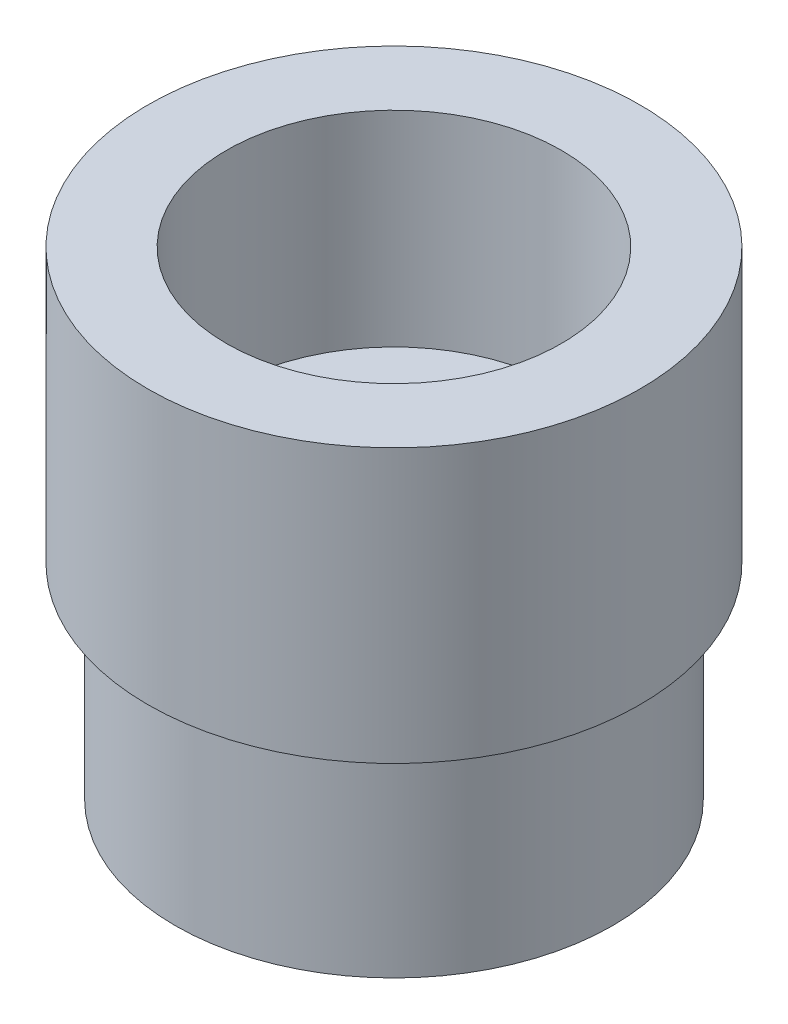
ISO-10303-21;
HEADER;
FILE_DESCRIPTION(('STEP AP214'),'2;1');
FILE_NAME('part.step','',(''),(''),'','','');
FILE_SCHEMA(('AUTOMOTIVE_DESIGN { 1 0 10303 214 1 1 1 1 }'));
ENDSEC;
DATA;
#1=APPLICATION_CONTEXT('core data for automotive mechanical design processes');
#2=APPLICATION_PROTOCOL_DEFINITION('international standard','automotive_design',2000,#1);
#3=PRODUCT_CONTEXT('',#1,'mechanical');
#4=PRODUCT('Part','Part','',(#3));
#5=PRODUCT_RELATED_PRODUCT_CATEGORY('part','',(#4));
#6=PRODUCT_DEFINITION_FORMATION('','',#4);
#7=PRODUCT_DEFINITION_CONTEXT('part definition',#1,'design');
#8=PRODUCT_DEFINITION('design','',#6,#7);
#9=PRODUCT_DEFINITION_SHAPE('','',#8);
#10=(LENGTH_UNIT() NAMED_UNIT(*) SI_UNIT(.MILLI.,.METRE.));
#11=(NAMED_UNIT(*) PLANE_ANGLE_UNIT() SI_UNIT($,.RADIAN.));
#12=(NAMED_UNIT(*) SI_UNIT($,.STERADIAN.) SOLID_ANGLE_UNIT());
#13=UNCERTAINTY_MEASURE_WITH_UNIT(LENGTH_MEASURE(1.E-05),#10,'distance_accuracy_value','');
#14=(GEOMETRIC_REPRESENTATION_CONTEXT(3) GLOBAL_UNCERTAINTY_ASSIGNED_CONTEXT((#13)) GLOBAL_UNIT_ASSIGNED_CONTEXT((#10,
#11,#12)) REPRESENTATION_CONTEXT('',''));
#15=CARTESIAN_POINT('',(0.,0.,0.));
#16=DIRECTION('',(0.,0.,1.));
#17=DIRECTION('',(1.,0.,0.));
#18=AXIS2_PLACEMENT_3D('',#15,#16,#17);
#19=CARTESIAN_POINT('',(0.,5.08,0.));
#20=DIRECTION('',(0.,-1.,0.));
#21=DIRECTION('',(0.,0.,-1.));
#22=AXIS2_PLACEMENT_3D('',#19,#20,#21);
#23=CYLINDRICAL_SURFACE('',#22,4.572);
#24=CARTESIAN_POINT('',(0.,5.08,0.));
#25=DIRECTION('',(0.,1.,0.));
#26=DIRECTION('',(0.,0.,1.));
#27=AXIS2_PLACEMENT_3D('',#24,#25,#26);
#28=CIRCLE('',#27,4.572);
#29=CARTESIAN_POINT('',(0.,5.08,4.572));
#30=VERTEX_POINT('',#29);
#31=EDGE_CURVE('E50',#30,#30,#28,.T.);
#32=ORIENTED_EDGE('',*,*,#31,.F.);
#33=EDGE_LOOP('',(#32));
#34=FACE_BOUND('',#33,.T.);
#35=CARTESIAN_POINT('',(0.,0.,0.));
#36=DIRECTION('',(0.,1.,0.));
#37=DIRECTION('',(0.,0.,1.));
#38=AXIS2_PLACEMENT_3D('',#35,#36,#37);
#39=CIRCLE('',#38,4.572);
#40=CARTESIAN_POINT('',(0.,0.,4.572));
#41=VERTEX_POINT('',#40);
#42=EDGE_CURVE('E55',#41,#41,#39,.T.);
#43=ORIENTED_EDGE('',*,*,#42,.T.);
#44=EDGE_LOOP('',(#43));
#45=FACE_BOUND('',#44,.T.);
#46=ADVANCED_FACE('F43',(#34,#45),#23,.T.);
#47=CARTESIAN_POINT('',(0.,5.08,0.));
#48=DIRECTION('',(0.,1.,0.));
#49=DIRECTION('',(0.,0.,1.));
#50=AXIS2_PLACEMENT_3D('',#47,#48,#49);
#51=PLANE('',#50);
#52=CARTESIAN_POINT('',(0.,5.08,0.));
#53=DIRECTION('',(0.,1.,0.));
#54=DIRECTION('',(0.,0.,1.));
#55=AXIS2_PLACEMENT_3D('',#52,#53,#54);
#56=CIRCLE('',#55,3.1115);
#57=CARTESIAN_POINT('',(0.,5.08,3.1115));
#58=VERTEX_POINT('',#57);
#59=EDGE_CURVE('E63',#58,#58,#56,.T.);
#60=ORIENTED_EDGE('',*,*,#59,.F.);
#61=EDGE_LOOP('',(#60));
#62=FACE_BOUND('',#61,.T.);
#63=ORIENTED_EDGE('',*,*,#31,.T.);
#64=EDGE_LOOP('',(#63));
#65=FACE_BOUND('',#64,.T.);
#66=ADVANCED_FACE('F103',(#62,#65),#51,.T.);
#67=CARTESIAN_POINT('',(0.,0.,0.));
#68=DIRECTION('',(0.,1.,0.));
#69=DIRECTION('',(0.,0.,1.));
#70=AXIS2_PLACEMENT_3D('',#67,#68,#69);
#71=PLANE('',#70);
#72=CARTESIAN_POINT('',(0.,0.,0.));
#73=DIRECTION('',(0.,1.,0.));
#74=DIRECTION('',(0.,0.,1.));
#75=AXIS2_PLACEMENT_3D('',#72,#73,#74);
#76=CIRCLE('',#75,4.064);
#77=CARTESIAN_POINT('',(0.,0.,4.064));
#78=VERTEX_POINT('',#77);
#79=EDGE_CURVE('E11',#78,#78,#76,.F.);
#80=ORIENTED_EDGE('',*,*,#79,.F.);
#81=EDGE_LOOP('',(#80));
#82=FACE_BOUND('',#81,.T.);
#83=ORIENTED_EDGE('',*,*,#42,.F.);
#84=EDGE_LOOP('',(#83));
#85=FACE_BOUND('',#84,.T.);
#86=ADVANCED_FACE('F108',(#82,#85),#71,.F.);
#87=CARTESIAN_POINT('',(0.,1.27,0.));
#88=DIRECTION('',(0.,1.,0.));
#89=DIRECTION('',(0.,0.,1.));
#90=AXIS2_PLACEMENT_3D('',#87,#88,#89);
#91=CYLINDRICAL_SURFACE('',#90,3.1115);
#92=CARTESIAN_POINT('',(0.,1.27,0.));
#93=DIRECTION('',(0.,1.,0.));
#94=DIRECTION('',(0.,0.,1.));
#95=AXIS2_PLACEMENT_3D('',#92,#93,#94);
#96=CIRCLE('',#95,3.1115);
#97=CARTESIAN_POINT('',(0.,1.27,3.1115));
#98=VERTEX_POINT('',#97);
#99=EDGE_CURVE('E61',#98,#98,#96,.T.);
#100=CARTESIAN_POINT('',(0.,1.27,3.1115));
#101=CARTESIAN_POINT('',(0.,1.3096875,3.1115));
#102=CARTESIAN_POINT('',(0.,1.349375,3.1115));
#103=CARTESIAN_POINT('',(0.,1.42875,3.1115));
#104=CARTESIAN_POINT('',(0.,1.4684375,3.1115));
#105=CARTESIAN_POINT('',(0.,1.5478125,3.1115));
#106=CARTESIAN_POINT('',(0.,1.5875,3.1115));
#107=CARTESIAN_POINT('',(0.,1.666875,3.1115));
#108=CARTESIAN_POINT('',(0.,1.7065625,3.1115));
#109=CARTESIAN_POINT('',(0.,1.7859375,3.1115));
#110=CARTESIAN_POINT('',(0.,1.825625,3.1115));
#111=CARTESIAN_POINT('',(0.,1.905,3.1115));
#112=CARTESIAN_POINT('',(0.,1.9446875,3.1115));
#113=CARTESIAN_POINT('',(0.,2.0240625,3.1115));
#114=CARTESIAN_POINT('',(0.,2.06375,3.1115));
#115=CARTESIAN_POINT('',(0.,2.143125,3.1115));
#116=CARTESIAN_POINT('',(0.,2.1828125,3.1115));
#117=CARTESIAN_POINT('',(0.,2.2621875,3.1115));
#118=CARTESIAN_POINT('',(0.,2.301875,3.1115));
#119=CARTESIAN_POINT('',(0.,2.38125,3.1115));
#120=CARTESIAN_POINT('',(0.,2.4209375,3.1115));
#121=CARTESIAN_POINT('',(0.,2.5003125,3.1115));
#122=CARTESIAN_POINT('',(0.,2.54,3.1115));
#123=CARTESIAN_POINT('',(0.,2.619375,3.1115));
#124=CARTESIAN_POINT('',(0.,2.6590625,3.1115));
#125=CARTESIAN_POINT('',(0.,2.7384375,3.1115));
#126=CARTESIAN_POINT('',(0.,2.778125,3.1115));
#127=CARTESIAN_POINT('',(0.,2.8575,3.1115));
#128=CARTESIAN_POINT('',(0.,2.8971875,3.1115));
#129=CARTESIAN_POINT('',(0.,2.9765625,3.1115));
#130=CARTESIAN_POINT('',(0.,3.01625,3.1115));
#131=CARTESIAN_POINT('',(0.,3.095625,3.1115));
#132=CARTESIAN_POINT('',(0.,3.1353125,3.1115));
#133=CARTESIAN_POINT('',(0.,3.2146875,3.1115));
#134=CARTESIAN_POINT('',(0.,3.254375,3.1115));
#135=CARTESIAN_POINT('',(0.,3.33375,3.1115));
#136=CARTESIAN_POINT('',(0.,3.3734375,3.1115));
#137=CARTESIAN_POINT('',(0.,3.4528125,3.1115));
#138=CARTESIAN_POINT('',(0.,3.4925,3.1115));
#139=CARTESIAN_POINT('',(0.,3.571875,3.1115));
#140=CARTESIAN_POINT('',(0.,3.6115625,3.1115));
#141=CARTESIAN_POINT('',(0.,3.6909375,3.1115));
#142=CARTESIAN_POINT('',(0.,3.730625,3.1115));
#143=CARTESIAN_POINT('',(0.,3.81,3.1115));
#144=CARTESIAN_POINT('',(0.,3.8496875,3.1115));
#145=CARTESIAN_POINT('',(0.,3.9290625,3.1115));
#146=CARTESIAN_POINT('',(0.,3.96875,3.1115));
#147=CARTESIAN_POINT('',(0.,4.048125,3.1115));
#148=CARTESIAN_POINT('',(0.,4.0878125,3.1115));
#149=CARTESIAN_POINT('',(0.,4.1671875,3.1115));
#150=CARTESIAN_POINT('',(0.,4.206875,3.1115));
#151=CARTESIAN_POINT('',(0.,4.28625,3.1115));
#152=CARTESIAN_POINT('',(0.,4.3259375,3.1115));
#153=CARTESIAN_POINT('',(0.,4.4053125,3.1115));
#154=CARTESIAN_POINT('',(0.,4.445,3.1115));
#155=CARTESIAN_POINT('',(0.,4.524375,3.1115));
#156=CARTESIAN_POINT('',(0.,4.5640625,3.1115));
#157=CARTESIAN_POINT('',(0.,4.6434375,3.1115));
#158=CARTESIAN_POINT('',(0.,4.683125,3.1115));
#159=CARTESIAN_POINT('',(0.,4.7625,3.1115));
#160=CARTESIAN_POINT('',(0.,4.8021875,3.1115));
#161=CARTESIAN_POINT('',(0.,4.8815625,3.1115));
#162=CARTESIAN_POINT('',(0.,4.92125,3.1115));
#163=CARTESIAN_POINT('',(0.,5.000625,3.1115));
#164=CARTESIAN_POINT('',(0.,5.0403125,3.1115));
#165=CARTESIAN_POINT('',(0.,5.08,3.1115));
#166=B_SPLINE_CURVE_WITH_KNOTS('',3,(#100,#101,#102,#103,#104,#105,#106,#107,#108,#109,#110,
#111,#112,#113,#114,#115,#116,#117,#118,#119,#120,#121,#122,#123,#124,#125,#126,#127,#128,#129,
#130,#131,#132,#133,#134,#135,#136,#137,#138,#139,#140,#141,#142,#143,#144,#145,#146,#147,#148,
#149,#150,#151,#152,#153,#154,#155,#156,#157,#158,#159,#160,#161,#162,#163,#164,#165),
.UNSPECIFIED.,.F.,.F.,(4,2,2,2,2,2,2,2,2,2,2,2,2,2,2,2,2,2,2,2,2,2,2,2,2,2,2,2,2,2,2,2,4),(0.,
0.1190625,0.238125,0.3571875,0.47625,0.5953125,0.714375,0.8334375,0.9525,1.0715625,1.190625,
1.3096875,1.42875,1.5478125,1.666875,1.7859375,1.905,2.0240625,2.143125,2.2621875,2.38125,
2.5003125,2.619375,2.7384375,2.8575,2.9765625,3.095625,3.2146875,3.33375,3.4528125,3.571875,
3.6909375,3.81),.UNSPECIFIED.);
#167=EDGE_CURVE('BSEAM98',#98,#58,#166,.T.);
#168=ORIENTED_EDGE('',*,*,#99,.F.);
#169=ORIENTED_EDGE('',*,*,#59,.T.);
#170=ORIENTED_EDGE('',*,*,#167,.T.);
#171=ORIENTED_EDGE('',*,*,#167,.F.);
#172=EDGE_LOOP('',(#168,#170,#169,#171));
#173=FACE_BOUND('',#172,.T.);
#174=ADVANCED_FACE('F98',(#173),#91,.F.);
#175=CARTESIAN_POINT('',(0.,1.27,0.));
#176=DIRECTION('',(0.,1.,0.));
#177=DIRECTION('',(0.,0.,1.));
#178=AXIS2_PLACEMENT_3D('',#175,#176,#177);
#179=PLANE('',#178);
#180=ORIENTED_EDGE('',*,*,#99,.T.);
#181=EDGE_LOOP('',(#180));
#182=FACE_BOUND('',#181,.T.);
#183=ADVANCED_FACE('F89',(#182),#179,.T.);
#184=CARTESIAN_POINT('',(0.,-3.81,0.));
#185=DIRECTION('',(0.,-1.,0.));
#186=DIRECTION('',(0.,0.,-1.));
#187=AXIS2_PLACEMENT_3D('',#184,#185,#186);
#188=PLANE('',#187);
#189=CARTESIAN_POINT('',(0.,-3.81,0.));
#190=DIRECTION('',(0.,-1.,0.));
#191=DIRECTION('',(-1.,0.,0.));
#192=AXIS2_PLACEMENT_3D('',#189,#190,#191);
#193=CIRCLE('',#192,4.064);
#194=CARTESIAN_POINT('',(0.,-3.81,4.064));
#195=VERTEX_POINT('',#194);
#196=EDGE_CURVE('E67',#195,#195,#193,.T.);
#197=ORIENTED_EDGE('',*,*,#196,.T.);
#198=EDGE_LOOP('',(#197));
#199=FACE_BOUND('',#198,.T.);
#200=CARTESIAN_POINT('',(0.,-3.81,0.));
#201=DIRECTION('',(0.,-1.,0.));
#202=DIRECTION('',(0.,0.,-1.));
#203=AXIS2_PLACEMENT_3D('',#200,#201,#202);
#204=CIRCLE('',#203,2.794);
#205=CARTESIAN_POINT('',(0.,-3.81,2.794));
#206=VERTEX_POINT('',#205);
#207=EDGE_CURVE('E74',#206,#206,#204,.T.);
#208=ORIENTED_EDGE('',*,*,#207,.F.);
#209=EDGE_LOOP('',(#208));
#210=FACE_BOUND('',#209,.T.);
#211=ADVANCED_FACE('F86',(#199,#210),#188,.T.);
#212=CARTESIAN_POINT('',(0.,-3.81,0.));
#213=DIRECTION('',(0.,1.,0.));
#214=DIRECTION('',(0.,0.,1.));
#215=AXIS2_PLACEMENT_3D('',#212,#213,#214);
#216=CYLINDRICAL_SURFACE('',#215,4.064);
#217=CARTESIAN_POINT('',(0.,-3.81,4.064));
#218=CARTESIAN_POINT('',(0.,-3.7703125,4.064));
#219=CARTESIAN_POINT('',(0.,-3.730625,4.064));
#220=CARTESIAN_POINT('',(0.,-3.65125,4.064));
#221=CARTESIAN_POINT('',(0.,-3.6115625,4.064));
#222=CARTESIAN_POINT('',(0.,-3.5321875,4.064));
#223=CARTESIAN_POINT('',(0.,-3.4925,4.064));
#224=CARTESIAN_POINT('',(0.,-3.413125,4.064));
#225=CARTESIAN_POINT('',(0.,-3.3734375,4.064));
#226=CARTESIAN_POINT('',(0.,-3.2940625,4.064));
#227=CARTESIAN_POINT('',(0.,-3.254375,4.064));
#228=CARTESIAN_POINT('',(0.,-3.175,4.064));
#229=CARTESIAN_POINT('',(0.,-3.1353125,4.064));
#230=CARTESIAN_POINT('',(0.,-3.0559375,4.064));
#231=CARTESIAN_POINT('',(0.,-3.01625,4.064));
#232=CARTESIAN_POINT('',(0.,-2.936875,4.064));
#233=CARTESIAN_POINT('',(0.,-2.8971875,4.064));
#234=CARTESIAN_POINT('',(0.,-2.8178125,4.064));
#235=CARTESIAN_POINT('',(0.,-2.778125,4.064));
#236=CARTESIAN_POINT('',(0.,-2.69875,4.064));
#237=CARTESIAN_POINT('',(0.,-2.6590625,4.064));
#238=CARTESIAN_POINT('',(0.,-2.5796875,4.064));
#239=CARTESIAN_POINT('',(0.,-2.54,4.064));
#240=CARTESIAN_POINT('',(0.,-2.460625,4.064));
#241=CARTESIAN_POINT('',(0.,-2.4209375,4.064));
#242=CARTESIAN_POINT('',(0.,-2.3415625,4.064));
#243=CARTESIAN_POINT('',(0.,-2.301875,4.064));
#244=CARTESIAN_POINT('',(0.,-2.2225,4.064));
#245=CARTESIAN_POINT('',(0.,-2.1828125,4.064));
#246=CARTESIAN_POINT('',(0.,-2.1034375,4.064));
#247=CARTESIAN_POINT('',(0.,-2.06375,4.064));
#248=CARTESIAN_POINT('',(0.,-1.984375,4.064));
#249=CARTESIAN_POINT('',(0.,-1.9446875,4.064));
#250=CARTESIAN_POINT('',(0.,-1.8653125,4.064));
#251=CARTESIAN_POINT('',(0.,-1.825625,4.064));
#252=CARTESIAN_POINT('',(0.,-1.74625,4.064));
#253=CARTESIAN_POINT('',(0.,-1.7065625,4.064));
#254=CARTESIAN_POINT('',(0.,-1.6271875,4.064));
#255=CARTESIAN_POINT('',(0.,-1.5875,4.064));
#256=CARTESIAN_POINT('',(0.,-1.508125,4.064));
#257=CARTESIAN_POINT('',(0.,-1.4684375,4.064));
#258=CARTESIAN_POINT('',(0.,-1.3890625,4.064));
#259=CARTESIAN_POINT('',(0.,-1.349375,4.064));
#260=CARTESIAN_POINT('',(0.,-1.27,4.064));
#261=CARTESIAN_POINT('',(0.,-1.2303125,4.064));
#262=CARTESIAN_POINT('',(0.,-1.1509375,4.064));
#263=CARTESIAN_POINT('',(0.,-1.11125,4.064));
#264=CARTESIAN_POINT('',(0.,-1.031875,4.064));
#265=CARTESIAN_POINT('',(0.,-0.9921875,4.064));
#266=CARTESIAN_POINT('',(0.,-0.9128125,4.064));
#267=CARTESIAN_POINT('',(0.,-0.873125,4.064));
#268=CARTESIAN_POINT('',(0.,-0.79375,4.064));
#269=CARTESIAN_POINT('',(0.,-0.7540625,4.064));
#270=CARTESIAN_POINT('',(0.,-0.6746875,4.064));
#271=CARTESIAN_POINT('',(0.,-0.635,4.064));
#272=CARTESIAN_POINT('',(0.,-0.555625,4.064));
#273=CARTESIAN_POINT('',(0.,-0.5159375,4.064));
#274=CARTESIAN_POINT('',(0.,-0.4365625,4.064));
#275=CARTESIAN_POINT('',(0.,-0.396875,4.064));
#276=CARTESIAN_POINT('',(0.,-0.3175,4.064));
#277=CARTESIAN_POINT('',(0.,-0.2778125,4.064));
#278=CARTESIAN_POINT('',(0.,-0.1984375,4.064));
#279=CARTESIAN_POINT('',(0.,-0.15875,4.064));
#280=CARTESIAN_POINT('',(0.,-0.0793749999999999,4.064));
#281=CARTESIAN_POINT('',(0.,-0.0396874999999999,4.064));
#282=CARTESIAN_POINT('',(0.,0.,4.064));
#283=B_SPLINE_CURVE_WITH_KNOTS('',3,(#217,#218,#219,#220,#221,#222,#223,#224,#225,#226,#227,
#228,#229,#230,#231,#232,#233,#234,#235,#236,#237,#238,#239,#240,#241,#242,#243,#244,#245,#246,
#247,#248,#249,#250,#251,#252,#253,#254,#255,#256,#257,#258,#259,#260,#261,#262,#263,#264,#265,
#266,#267,#268,#269,#270,#271,#272,#273,#274,#275,#276,#277,#278,#279,#280,#281,#282),
.UNSPECIFIED.,.F.,.F.,(4,2,2,2,2,2,2,2,2,2,2,2,2,2,2,2,2,2,2,2,2,2,2,2,2,2,2,2,2,2,2,2,4),(0.,
0.1190625,0.238125,0.3571875,0.47625,0.5953125,0.714375,0.8334375,0.9525,1.0715625,1.190625,
1.3096875,1.42875,1.5478125,1.666875,1.7859375,1.905,2.0240625,2.143125,2.2621875,2.38125,
2.5003125,2.619375,2.7384375,2.8575,2.9765625,3.095625,3.2146875,3.33375,3.4528125,3.571875,
3.6909375,3.81),.UNSPECIFIED.);
#284=EDGE_CURVE('BSEAM88',#195,#78,#283,.T.);
#285=ORIENTED_EDGE('',*,*,#196,.F.);
#286=ORIENTED_EDGE('',*,*,#79,.T.);
#287=ORIENTED_EDGE('',*,*,#284,.T.);
#288=ORIENTED_EDGE('',*,*,#284,.F.);
#289=EDGE_LOOP('',(#285,#287,#286,#288));
#290=FACE_BOUND('',#289,.T.);
#291=ADVANCED_FACE('F88',(#290),#216,.T.);
#292=CARTESIAN_POINT('',(0.,-3.81,0.));
#293=DIRECTION('',(0.,1.,0.));
#294=DIRECTION('',(0.,0.,1.));
#295=AXIS2_PLACEMENT_3D('',#292,#293,#294);
#296=CYLINDRICAL_SURFACE('',#295,2.794);
#297=CARTESIAN_POINT('',(0.,0.,0.));
#298=DIRECTION('',(0.,-1.,0.));
#299=DIRECTION('',(0.,0.,-1.));
#300=AXIS2_PLACEMENT_3D('',#297,#298,#299);
#301=CIRCLE('',#300,2.794);
#302=CARTESIAN_POINT('',(0.,0.,2.794));
#303=VERTEX_POINT('',#302);
#304=EDGE_CURVE('E75',#303,#303,#301,.T.);
#305=CARTESIAN_POINT('',(0.,-3.81,2.794));
#306=CARTESIAN_POINT('',(0.,-3.7703125,2.794));
#307=CARTESIAN_POINT('',(0.,-3.730625,2.794));
#308=CARTESIAN_POINT('',(0.,-3.65125,2.794));
#309=CARTESIAN_POINT('',(0.,-3.6115625,2.794));
#310=CARTESIAN_POINT('',(0.,-3.5321875,2.794));
#311=CARTESIAN_POINT('',(0.,-3.4925,2.794));
#312=CARTESIAN_POINT('',(0.,-3.413125,2.794));
#313=CARTESIAN_POINT('',(0.,-3.3734375,2.794));
#314=CARTESIAN_POINT('',(0.,-3.2940625,2.794));
#315=CARTESIAN_POINT('',(0.,-3.254375,2.794));
#316=CARTESIAN_POINT('',(0.,-3.175,2.794));
#317=CARTESIAN_POINT('',(0.,-3.1353125,2.794));
#318=CARTESIAN_POINT('',(0.,-3.0559375,2.794));
#319=CARTESIAN_POINT('',(0.,-3.01625,2.794));
#320=CARTESIAN_POINT('',(0.,-2.936875,2.794));
#321=CARTESIAN_POINT('',(0.,-2.8971875,2.794));
#322=CARTESIAN_POINT('',(0.,-2.8178125,2.794));
#323=CARTESIAN_POINT('',(0.,-2.778125,2.794));
#324=CARTESIAN_POINT('',(0.,-2.69875,2.794));
#325=CARTESIAN_POINT('',(0.,-2.6590625,2.794));
#326=CARTESIAN_POINT('',(0.,-2.5796875,2.794));
#327=CARTESIAN_POINT('',(0.,-2.54,2.794));
#328=CARTESIAN_POINT('',(0.,-2.460625,2.794));
#329=CARTESIAN_POINT('',(0.,-2.4209375,2.794));
#330=CARTESIAN_POINT('',(0.,-2.3415625,2.794));
#331=CARTESIAN_POINT('',(0.,-2.301875,2.794));
#332=CARTESIAN_POINT('',(0.,-2.2225,2.794));
#333=CARTESIAN_POINT('',(0.,-2.1828125,2.794));
#334=CARTESIAN_POINT('',(0.,-2.1034375,2.794));
#335=CARTESIAN_POINT('',(0.,-2.06375,2.794));
#336=CARTESIAN_POINT('',(0.,-1.984375,2.794));
#337=CARTESIAN_POINT('',(0.,-1.9446875,2.794));
#338=CARTESIAN_POINT('',(0.,-1.8653125,2.794));
#339=CARTESIAN_POINT('',(0.,-1.825625,2.794));
#340=CARTESIAN_POINT('',(0.,-1.74625,2.794));
#341=CARTESIAN_POINT('',(0.,-1.7065625,2.794));
#342=CARTESIAN_POINT('',(0.,-1.6271875,2.794));
#343=CARTESIAN_POINT('',(0.,-1.5875,2.794));
#344=CARTESIAN_POINT('',(0.,-1.508125,2.794));
#345=CARTESIAN_POINT('',(0.,-1.4684375,2.794));
#346=CARTESIAN_POINT('',(0.,-1.3890625,2.794));
#347=CARTESIAN_POINT('',(0.,-1.349375,2.794));
#348=CARTESIAN_POINT('',(0.,-1.27,2.794));
#349=CARTESIAN_POINT('',(0.,-1.2303125,2.794));
#350=CARTESIAN_POINT('',(0.,-1.1509375,2.794));
#351=CARTESIAN_POINT('',(0.,-1.11125,2.794));
#352=CARTESIAN_POINT('',(0.,-1.031875,2.794));
#353=CARTESIAN_POINT('',(0.,-0.9921875,2.794));
#354=CARTESIAN_POINT('',(0.,-0.9128125,2.794));
#355=CARTESIAN_POINT('',(0.,-0.873125,2.794));
#356=CARTESIAN_POINT('',(0.,-0.79375,2.794));
#357=CARTESIAN_POINT('',(0.,-0.7540625,2.794));
#358=CARTESIAN_POINT('',(0.,-0.6746875,2.794));
#359=CARTESIAN_POINT('',(0.,-0.635,2.794));
#360=CARTESIAN_POINT('',(0.,-0.555625,2.794));
#361=CARTESIAN_POINT('',(0.,-0.5159375,2.794));
#362=CARTESIAN_POINT('',(0.,-0.4365625,2.794));
#363=CARTESIAN_POINT('',(0.,-0.396875,2.794));
#364=CARTESIAN_POINT('',(0.,-0.3175,2.794));
#365=CARTESIAN_POINT('',(0.,-0.2778125,2.794));
#366=CARTESIAN_POINT('',(0.,-0.1984375,2.794));
#367=CARTESIAN_POINT('',(0.,-0.15875,2.794));
#368=CARTESIAN_POINT('',(0.,-0.0793749999999999,2.794));
#369=CARTESIAN_POINT('',(0.,-0.0396874999999999,2.794));
#370=CARTESIAN_POINT('',(0.,0.,2.794));
#371=B_SPLINE_CURVE_WITH_KNOTS('',3,(#305,#306,#307,#308,#309,#310,#311,#312,#313,#314,#315,
#316,#317,#318,#319,#320,#321,#322,#323,#324,#325,#326,#327,#328,#329,#330,#331,#332,#333,#334,
#335,#336,#337,#338,#339,#340,#341,#342,#343,#344,#345,#346,#347,#348,#349,#350,#351,#352,#353,
#354,#355,#356,#357,#358,#359,#360,#361,#362,#363,#364,#365,#366,#367,#368,#369,#370),
.UNSPECIFIED.,.F.,.F.,(4,2,2,2,2,2,2,2,2,2,2,2,2,2,2,2,2,2,2,2,2,2,2,2,2,2,2,2,2,2,2,2,4),(0.,
0.1190625,0.238125,0.3571875,0.47625,0.5953125,0.714375,0.8334375,0.9525,1.0715625,1.190625,
1.3096875,1.42875,1.5478125,1.666875,1.7859375,1.905,2.0240625,2.143125,2.2621875,2.38125,
2.5003125,2.619375,2.7384375,2.8575,2.9765625,3.095625,3.2146875,3.33375,3.4528125,3.571875,
3.6909375,3.81),.UNSPECIFIED.);
#372=EDGE_CURVE('BSEAM83',#206,#303,#371,.T.);
#373=ORIENTED_EDGE('',*,*,#207,.T.);
#374=ORIENTED_EDGE('',*,*,#304,.F.);
#375=ORIENTED_EDGE('',*,*,#372,.T.);
#376=ORIENTED_EDGE('',*,*,#372,.F.);
#377=EDGE_LOOP('',(#373,#375,#374,#376));
#378=FACE_BOUND('',#377,.T.);
#379=ADVANCED_FACE('F83',(#378),#296,.F.);
#380=ORIENTED_EDGE('',*,*,#304,.T.);
#381=EDGE_LOOP('',(#380));
#382=FACE_BOUND('',#381,.T.);
#383=ADVANCED_FACE('F116',(#382),#71,.F.);
#384=CLOSED_SHELL('',(#46,#66,#86,#174,#183,#211,#291,#379,#383));
#385=MANIFOLD_SOLID_BREP('B2',#384);
#386=ADVANCED_BREP_SHAPE_REPRESENTATION('',(#18,#385),#14);
#387=SHAPE_DEFINITION_REPRESENTATION(#9,#386);
ENDSEC;
END-ISO-10303-21;
